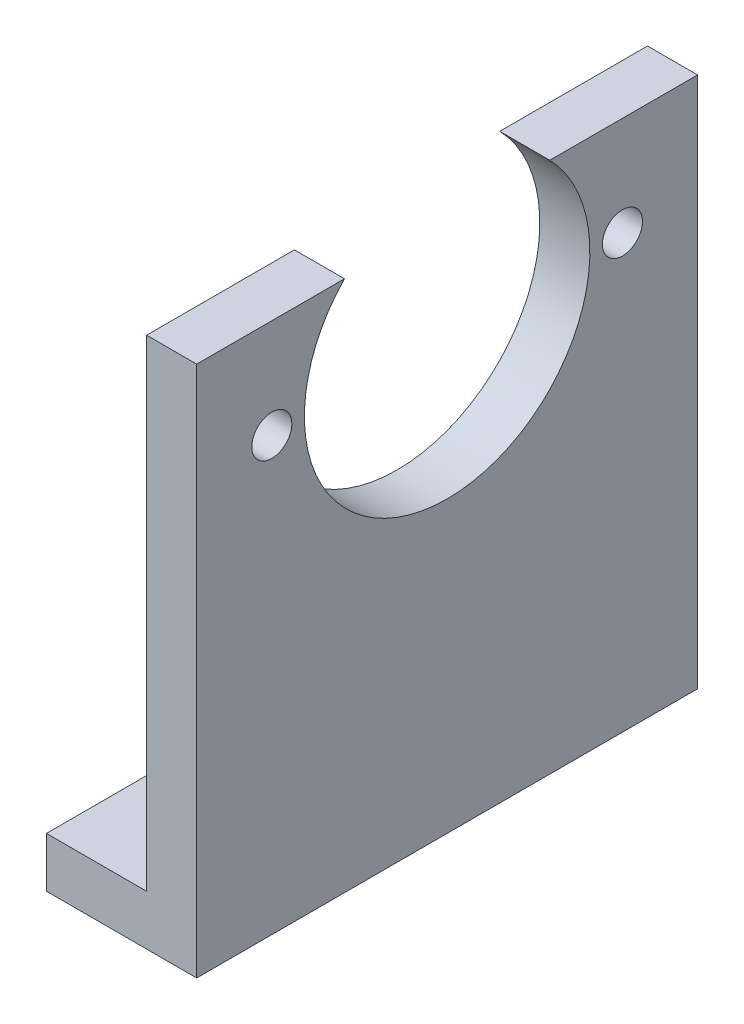
ISO-10303-21;
HEADER;
FILE_DESCRIPTION(('STEP AP214'),'2;1');
FILE_NAME('part.step','',(''),(''),'','','');
FILE_SCHEMA(('AUTOMOTIVE_DESIGN { 1 0 10303 214 1 1 1 1 }'));
ENDSEC;
DATA;
#1=APPLICATION_CONTEXT('core data for automotive mechanical design processes');
#2=APPLICATION_PROTOCOL_DEFINITION('international standard','automotive_design',2000,#1);
#3=PRODUCT_CONTEXT('',#1,'mechanical');
#4=PRODUCT('Part','Part','',(#3));
#5=PRODUCT_RELATED_PRODUCT_CATEGORY('part','',(#4));
#6=PRODUCT_DEFINITION_FORMATION('','',#4);
#7=PRODUCT_DEFINITION_CONTEXT('part definition',#1,'design');
#8=PRODUCT_DEFINITION('design','',#6,#7);
#9=PRODUCT_DEFINITION_SHAPE('','',#8);
#10=(LENGTH_UNIT() NAMED_UNIT(*) SI_UNIT(.MILLI.,.METRE.));
#11=(NAMED_UNIT(*) PLANE_ANGLE_UNIT() SI_UNIT($,.RADIAN.));
#12=(NAMED_UNIT(*) SI_UNIT($,.STERADIAN.) SOLID_ANGLE_UNIT());
#13=UNCERTAINTY_MEASURE_WITH_UNIT(LENGTH_MEASURE(1.E-05),#10,'distance_accuracy_value','');
#14=(GEOMETRIC_REPRESENTATION_CONTEXT(3) GLOBAL_UNCERTAINTY_ASSIGNED_CONTEXT((#13)) GLOBAL_UNIT_ASSIGNED_CONTEXT((#10,
#11,#12)) REPRESENTATION_CONTEXT('',''));
#15=CARTESIAN_POINT('',(0.,0.,0.));
#16=DIRECTION('',(0.,0.,1.));
#17=DIRECTION('',(1.,0.,0.));
#18=AXIS2_PLACEMENT_3D('',#15,#16,#17);
#19=CARTESIAN_POINT('',(0.,0.,0.));
#20=DIRECTION('',(1.,0.,0.));
#21=DIRECTION('',(0.,0.,-1.));
#22=AXIS2_PLACEMENT_3D('',#19,#20,#21);
#23=PLANE('',#22);
#24=CARTESIAN_POINT('',(0.,0.,17.5));
#25=DIRECTION('',(1.,0.,0.));
#26=DIRECTION('',(0.,0.,-1.));
#27=AXIS2_PLACEMENT_3D('',#24,#25,#26);
#28=CIRCLE('',#27,2.);
#29=CARTESIAN_POINT('',(0.,0.,15.5));
#30=VERTEX_POINT('',#29);
#31=EDGE_CURVE('E155',#30,#30,#28,.T.);
#32=ORIENTED_EDGE('',*,*,#31,.T.);
#33=EDGE_LOOP('',(#32));
#34=FACE_BOUND('',#33,.T.);
#35=CARTESIAN_POINT('',(0.,0.,-17.5));
#36=DIRECTION('',(1.,0.,0.));
#37=DIRECTION('',(0.,0.,-1.));
#38=AXIS2_PLACEMENT_3D('',#35,#36,#37);
#39=CIRCLE('',#38,2.);
#40=CARTESIAN_POINT('',(0.,0.,-19.5));
#41=VERTEX_POINT('',#40);
#42=EDGE_CURVE('E165',#41,#41,#39,.T.);
#43=ORIENTED_EDGE('',*,*,#42,.T.);
#44=EDGE_LOOP('',(#43));
#45=FACE_BOUND('',#44,.T.);
#46=DIRECTION('',(0.,0.,-1.));
#47=VECTOR('',#46,1.);
#48=CARTESIAN_POINT('',(0.,-38.1668992247954,-25.));
#49=LINE('',#48,#47);
#50=CARTESIAN_POINT('',(0.,-38.1668992247954,25.));
#51=VERTEX_POINT('',#50);
#52=CARTESIAN_POINT('',(0.,-38.1668992247954,-25.));
#53=VERTEX_POINT('',#52);
#54=EDGE_CURVE('E50',#51,#53,#49,.T.);
#55=ORIENTED_EDGE('',*,*,#54,.F.);
#56=DIRECTION('',(0.,-1.,0.));
#57=VECTOR('',#56,1.);
#58=CARTESIAN_POINT('',(0.,9.90310077520462,25.));
#59=LINE('',#58,#57);
#60=CARTESIAN_POINT('',(0.,9.90310077520462,25.));
#61=VERTEX_POINT('',#60);
#62=EDGE_CURVE('E131',#61,#51,#59,.T.);
#63=ORIENTED_EDGE('',*,*,#62,.F.);
#64=DIRECTION('',(0.,0.,1.));
#65=VECTOR('',#64,1.);
#66=CARTESIAN_POINT('',(0.,9.90310077520462,25.));
#67=LINE('',#66,#65);
#68=CARTESIAN_POINT('',(0.,9.90310077520462,10.2465162390025));
#69=VERTEX_POINT('',#68);
#70=EDGE_CURVE('E81',#69,#61,#67,.T.);
#71=ORIENTED_EDGE('',*,*,#70,.F.);
#72=CARTESIAN_POINT('',(0.,0.,0.));
#73=DIRECTION('',(-1.,0.,0.));
#74=DIRECTION('',(0.,0.,-1.));
#75=AXIS2_PLACEMENT_3D('',#72,#73,#74);
#76=CIRCLE('',#75,14.25);
#77=CARTESIAN_POINT('',(0.,9.90310077520463,-10.2465162390025));
#78=VERTEX_POINT('',#77);
#79=EDGE_CURVE('E114',#78,#69,#76,.T.);
#80=ORIENTED_EDGE('',*,*,#79,.F.);
#81=DIRECTION('',(0.,0.,1.));
#82=VECTOR('',#81,1.);
#83=CARTESIAN_POINT('',(0.,9.90310077520463,-10.2465162390025));
#84=LINE('',#83,#82);
#85=CARTESIAN_POINT('',(0.,9.90310077520463,-25.));
#86=VERTEX_POINT('',#85);
#87=EDGE_CURVE('E126',#86,#78,#84,.T.);
#88=ORIENTED_EDGE('',*,*,#87,.F.);
#89=DIRECTION('',(0.,1.,0.));
#90=VECTOR('',#89,1.);
#91=CARTESIAN_POINT('',(0.,9.90310077520463,-25.));
#92=LINE('',#91,#90);
#93=EDGE_CURVE('E124',#53,#86,#92,.T.);
#94=ORIENTED_EDGE('',*,*,#93,.F.);
#95=EDGE_LOOP('',(#55,#63,#71,#80,#88,#94));
#96=FACE_BOUND('',#95,.T.);
#97=ADVANCED_FACE('F35',(#34,#45,#96),#23,.F.);
#98=CARTESIAN_POINT('',(5.,0.,0.));
#99=DIRECTION('',(1.,0.,0.));
#100=DIRECTION('',(0.,0.,-1.));
#101=AXIS2_PLACEMENT_3D('',#98,#99,#100);
#102=PLANE('',#101);
#103=CARTESIAN_POINT('',(5.,0.,-17.5));
#104=DIRECTION('',(1.,0.,0.));
#105=DIRECTION('',(0.,0.,-1.));
#106=AXIS2_PLACEMENT_3D('',#103,#104,#105);
#107=CIRCLE('',#106,2.);
#108=CARTESIAN_POINT('',(5.,0.,-19.5));
#109=VERTEX_POINT('',#108);
#110=EDGE_CURVE('E127',#109,#109,#107,.T.);
#111=ORIENTED_EDGE('',*,*,#110,.F.);
#112=EDGE_LOOP('',(#111));
#113=FACE_BOUND('',#112,.T.);
#114=DIRECTION('',(0.,0.,-1.));
#115=VECTOR('',#114,1.);
#116=CARTESIAN_POINT('',(5.,-43.1668992247954,25.));
#117=LINE('',#116,#115);
#118=CARTESIAN_POINT('',(5.,-43.1668992247954,25.));
#119=VERTEX_POINT('',#118);
#120=CARTESIAN_POINT('',(5.,-43.1668992247954,-25.));
#121=VERTEX_POINT('',#120);
#122=EDGE_CURVE('E133',#119,#121,#117,.T.);
#123=ORIENTED_EDGE('',*,*,#122,.T.);
#124=DIRECTION('',(0.,1.,0.));
#125=VECTOR('',#124,1.);
#126=CARTESIAN_POINT('',(5.,9.90310077520463,-25.));
#127=LINE('',#126,#125);
#128=CARTESIAN_POINT('',(5.,9.90310077520463,-25.));
#129=VERTEX_POINT('',#128);
#130=EDGE_CURVE('E89',#121,#129,#127,.T.);
#131=ORIENTED_EDGE('',*,*,#130,.T.);
#132=DIRECTION('',(0.,0.,1.));
#133=VECTOR('',#132,1.);
#134=CARTESIAN_POINT('',(5.,9.90310077520463,-10.2465162390025));
#135=LINE('',#134,#133);
#136=CARTESIAN_POINT('',(5.,9.90310077520463,-10.2465162390025));
#137=VERTEX_POINT('',#136);
#138=EDGE_CURVE('E106',#129,#137,#135,.T.);
#139=ORIENTED_EDGE('',*,*,#138,.T.);
#140=CARTESIAN_POINT('',(5.,0.,0.));
#141=DIRECTION('',(-1.,0.,0.));
#142=DIRECTION('',(0.,0.,-1.));
#143=AXIS2_PLACEMENT_3D('',#140,#141,#142);
#144=CIRCLE('',#143,14.25);
#145=CARTESIAN_POINT('',(5.,9.90310077520462,10.2465162390025));
#146=VERTEX_POINT('',#145);
#147=EDGE_CURVE('E99',#137,#146,#144,.T.);
#148=ORIENTED_EDGE('',*,*,#147,.T.);
#149=DIRECTION('',(0.,0.,1.));
#150=VECTOR('',#149,1.);
#151=CARTESIAN_POINT('',(5.,9.90310077520462,25.));
#152=LINE('',#151,#150);
#153=CARTESIAN_POINT('',(5.,9.90310077520462,25.));
#154=VERTEX_POINT('',#153);
#155=EDGE_CURVE('E104',#146,#154,#152,.T.);
#156=ORIENTED_EDGE('',*,*,#155,.T.);
#157=DIRECTION('',(0.,-1.,0.));
#158=VECTOR('',#157,1.);
#159=CARTESIAN_POINT('',(5.,9.90310077520462,25.));
#160=LINE('',#159,#158);
#161=EDGE_CURVE('E59',#154,#119,#160,.T.);
#162=ORIENTED_EDGE('',*,*,#161,.T.);
#163=EDGE_LOOP('',(#123,#131,#139,#148,#156,#162));
#164=FACE_BOUND('',#163,.T.);
#165=CARTESIAN_POINT('',(5.,0.,17.5));
#166=DIRECTION('',(1.,0.,0.));
#167=DIRECTION('',(0.,0.,-1.));
#168=AXIS2_PLACEMENT_3D('',#165,#166,#167);
#169=CIRCLE('',#168,2.);
#170=CARTESIAN_POINT('',(5.,0.,15.5));
#171=VERTEX_POINT('',#170);
#172=EDGE_CURVE('E159',#171,#171,#169,.T.);
#173=ORIENTED_EDGE('',*,*,#172,.F.);
#174=EDGE_LOOP('',(#173));
#175=FACE_BOUND('',#174,.T.);
#176=ADVANCED_FACE('F101',(#113,#164,#175),#102,.T.);
#177=CARTESIAN_POINT('',(5.,-43.1668992247954,25.));
#178=DIRECTION('',(0.,1.,0.));
#179=DIRECTION('',(0.,0.,1.));
#180=AXIS2_PLACEMENT_3D('',#177,#178,#179);
#181=PLANE('',#180);
#182=DIRECTION('',(-1.,0.,0.));
#183=VECTOR('',#182,1.);
#184=CARTESIAN_POINT('',(5.,-43.1668992247954,25.));
#185=LINE('',#184,#183);
#186=CARTESIAN_POINT('',(-10.,-43.1668992247954,25.));
#187=VERTEX_POINT('',#186);
#188=EDGE_CURVE('E120',#119,#187,#185,.T.);
#189=ORIENTED_EDGE('',*,*,#188,.T.);
#190=DIRECTION('',(0.,0.,1.));
#191=VECTOR('',#190,1.);
#192=CARTESIAN_POINT('',(-10.,-43.1668992247954,-25.));
#193=LINE('',#192,#191);
#194=CARTESIAN_POINT('',(-10.,-43.1668992247954,-25.));
#195=VERTEX_POINT('',#194);
#196=EDGE_CURVE('E178',#195,#187,#193,.T.);
#197=ORIENTED_EDGE('',*,*,#196,.F.);
#198=DIRECTION('',(-1.,0.,0.));
#199=VECTOR('',#198,1.);
#200=CARTESIAN_POINT('',(5.,-43.1668992247954,-25.));
#201=LINE('',#200,#199);
#202=EDGE_CURVE('E11',#121,#195,#201,.T.);
#203=ORIENTED_EDGE('',*,*,#202,.F.);
#204=ORIENTED_EDGE('',*,*,#122,.F.);
#205=EDGE_LOOP('',(#189,#197,#203,#204));
#206=FACE_BOUND('',#205,.T.);
#207=ADVANCED_FACE('F37',(#206),#181,.F.);
#208=CARTESIAN_POINT('',(5.,9.90310077520463,-25.));
#209=DIRECTION('',(0.,0.,1.));
#210=DIRECTION('',(0.,-1.,0.));
#211=AXIS2_PLACEMENT_3D('',#208,#209,#210);
#212=PLANE('',#211);
#213=ORIENTED_EDGE('',*,*,#202,.T.);
#214=DIRECTION('',(0.,-1.,0.));
#215=VECTOR('',#214,1.);
#216=CARTESIAN_POINT('',(-10.,-43.1668992247954,-25.));
#217=LINE('',#216,#215);
#218=CARTESIAN_POINT('',(-10.,-38.1668992247954,-25.));
#219=VERTEX_POINT('',#218);
#220=EDGE_CURVE('E182',#219,#195,#217,.T.);
#221=ORIENTED_EDGE('',*,*,#220,.F.);
#222=DIRECTION('',(1.,0.,0.));
#223=VECTOR('',#222,1.);
#224=CARTESIAN_POINT('',(-10.,-38.1668992247954,-25.));
#225=LINE('',#224,#223);
#226=EDGE_CURVE('E156',#219,#53,#225,.T.);
#227=ORIENTED_EDGE('',*,*,#226,.T.);
#228=ORIENTED_EDGE('',*,*,#93,.T.);
#229=DIRECTION('',(-1.,0.,0.));
#230=VECTOR('',#229,1.);
#231=CARTESIAN_POINT('',(5.,9.90310077520463,-25.));
#232=LINE('',#231,#230);
#233=EDGE_CURVE('E43',#129,#86,#232,.T.);
#234=ORIENTED_EDGE('',*,*,#233,.F.);
#235=ORIENTED_EDGE('',*,*,#130,.F.);
#236=EDGE_LOOP('',(#213,#221,#227,#228,#234,#235));
#237=FACE_BOUND('',#236,.T.);
#238=ADVANCED_FACE('F181',(#237),#212,.F.);
#239=CARTESIAN_POINT('',(5.,9.90310077520463,-10.2465162390025));
#240=DIRECTION('',(0.,-1.,0.));
#241=DIRECTION('',(0.,0.,-1.));
#242=AXIS2_PLACEMENT_3D('',#239,#240,#241);
#243=PLANE('',#242);
#244=ORIENTED_EDGE('',*,*,#87,.T.);
#245=DIRECTION('',(-1.,0.,0.));
#246=VECTOR('',#245,1.);
#247=CARTESIAN_POINT('',(5.,9.90310077520463,-10.2465162390025));
#248=LINE('',#247,#246);
#249=EDGE_CURVE('E115',#137,#78,#248,.T.);
#250=ORIENTED_EDGE('',*,*,#249,.F.);
#251=ORIENTED_EDGE('',*,*,#138,.F.);
#252=ORIENTED_EDGE('',*,*,#233,.T.);
#253=EDGE_LOOP('',(#244,#250,#251,#252));
#254=FACE_BOUND('',#253,.T.);
#255=ADVANCED_FACE('F140',(#254),#243,.F.);
#256=CARTESIAN_POINT('',(5.,0.,0.));
#257=DIRECTION('',(-1.,0.,0.));
#258=DIRECTION('',(0.,0.,1.));
#259=AXIS2_PLACEMENT_3D('',#256,#257,#258);
#260=CYLINDRICAL_SURFACE('',#259,14.25);
#261=ORIENTED_EDGE('',*,*,#79,.T.);
#262=DIRECTION('',(-1.,0.,0.));
#263=VECTOR('',#262,1.);
#264=CARTESIAN_POINT('',(5.,9.90310077520462,10.2465162390025));
#265=LINE('',#264,#263);
#266=EDGE_CURVE('E111',#146,#69,#265,.T.);
#267=ORIENTED_EDGE('',*,*,#266,.F.);
#268=ORIENTED_EDGE('',*,*,#147,.F.);
#269=ORIENTED_EDGE('',*,*,#249,.T.);
#270=EDGE_LOOP('',(#261,#267,#268,#269));
#271=FACE_BOUND('',#270,.T.);
#272=ADVANCED_FACE('F112',(#271),#260,.F.);
#273=CARTESIAN_POINT('',(5.,9.90310077520462,25.));
#274=DIRECTION('',(0.,-1.,0.));
#275=DIRECTION('',(0.,0.,-1.));
#276=AXIS2_PLACEMENT_3D('',#273,#274,#275);
#277=PLANE('',#276);
#278=ORIENTED_EDGE('',*,*,#70,.T.);
#279=DIRECTION('',(-1.,0.,0.));
#280=VECTOR('',#279,1.);
#281=CARTESIAN_POINT('',(5.,9.90310077520462,25.));
#282=LINE('',#281,#280);
#283=EDGE_CURVE('E116',#154,#61,#282,.T.);
#284=ORIENTED_EDGE('',*,*,#283,.F.);
#285=ORIENTED_EDGE('',*,*,#155,.F.);
#286=ORIENTED_EDGE('',*,*,#266,.T.);
#287=EDGE_LOOP('',(#278,#284,#285,#286));
#288=FACE_BOUND('',#287,.T.);
#289=ADVANCED_FACE('F118',(#288),#277,.F.);
#290=CARTESIAN_POINT('',(5.,9.90310077520462,25.));
#291=DIRECTION('',(0.,0.,-1.));
#292=DIRECTION('',(0.,1.,0.));
#293=AXIS2_PLACEMENT_3D('',#290,#291,#292);
#294=PLANE('',#293);
#295=ORIENTED_EDGE('',*,*,#62,.T.);
#296=DIRECTION('',(1.,0.,0.));
#297=VECTOR('',#296,1.);
#298=CARTESIAN_POINT('',(-10.,-38.1668992247954,25.));
#299=LINE('',#298,#297);
#300=CARTESIAN_POINT('',(-10.,-38.1668992247954,25.));
#301=VERTEX_POINT('',#300);
#302=EDGE_CURVE('E147',#301,#51,#299,.T.);
#303=ORIENTED_EDGE('',*,*,#302,.F.);
#304=DIRECTION('',(0.,1.,0.));
#305=VECTOR('',#304,1.);
#306=CARTESIAN_POINT('',(-10.,-43.1668992247954,25.));
#307=LINE('',#306,#305);
#308=EDGE_CURVE('E190',#187,#301,#307,.T.);
#309=ORIENTED_EDGE('',*,*,#308,.F.);
#310=ORIENTED_EDGE('',*,*,#188,.F.);
#311=ORIENTED_EDGE('',*,*,#161,.F.);
#312=ORIENTED_EDGE('',*,*,#283,.T.);
#313=EDGE_LOOP('',(#295,#303,#309,#310,#311,#312));
#314=FACE_BOUND('',#313,.T.);
#315=ADVANCED_FACE('F144',(#314),#294,.F.);
#316=CARTESIAN_POINT('',(5.,0.,-17.5));
#317=DIRECTION('',(-1.,0.,0.));
#318=DIRECTION('',(0.,0.,1.));
#319=AXIS2_PLACEMENT_3D('',#316,#317,#318);
#320=CYLINDRICAL_SURFACE('',#319,2.);
#321=ORIENTED_EDGE('',*,*,#110,.T.);
#322=EDGE_LOOP('',(#321));
#323=FACE_BOUND('',#322,.T.);
#324=ORIENTED_EDGE('',*,*,#42,.F.);
#325=EDGE_LOOP('',(#324));
#326=FACE_BOUND('',#325,.T.);
#327=ADVANCED_FACE('F215',(#323,#326),#320,.F.);
#328=CARTESIAN_POINT('',(5.,0.,17.5));
#329=DIRECTION('',(-1.,0.,0.));
#330=DIRECTION('',(0.,0.,1.));
#331=AXIS2_PLACEMENT_3D('',#328,#329,#330);
#332=CYLINDRICAL_SURFACE('',#331,2.);
#333=ORIENTED_EDGE('',*,*,#172,.T.);
#334=EDGE_LOOP('',(#333));
#335=FACE_BOUND('',#334,.T.);
#336=ORIENTED_EDGE('',*,*,#31,.F.);
#337=EDGE_LOOP('',(#336));
#338=FACE_BOUND('',#337,.T.);
#339=ADVANCED_FACE('F200',(#335,#338),#332,.F.);
#340=CARTESIAN_POINT('',(-10.,-38.1668992247954,-25.));
#341=DIRECTION('',(0.,-1.,0.));
#342=DIRECTION('',(0.,0.,-1.));
#343=AXIS2_PLACEMENT_3D('',#340,#341,#342);
#344=PLANE('',#343);
#345=ORIENTED_EDGE('',*,*,#54,.T.);
#346=ORIENTED_EDGE('',*,*,#226,.F.);
#347=DIRECTION('',(0.,0.,-1.));
#348=VECTOR('',#347,1.);
#349=CARTESIAN_POINT('',(-10.,-38.1668992247954,-25.));
#350=LINE('',#349,#348);
#351=EDGE_CURVE('E154',#301,#219,#350,.T.);
#352=ORIENTED_EDGE('',*,*,#351,.F.);
#353=ORIENTED_EDGE('',*,*,#302,.T.);
#354=EDGE_LOOP('',(#345,#346,#352,#353));
#355=FACE_BOUND('',#354,.T.);
#356=ADVANCED_FACE('F150',(#355),#344,.F.);
#357=CARTESIAN_POINT('',(-10.,0.,0.));
#358=DIRECTION('',(1.,0.,0.));
#359=DIRECTION('',(0.,0.,-1.));
#360=AXIS2_PLACEMENT_3D('',#357,#358,#359);
#361=PLANE('',#360);
#362=ORIENTED_EDGE('',*,*,#220,.T.);
#363=ORIENTED_EDGE('',*,*,#196,.T.);
#364=ORIENTED_EDGE('',*,*,#308,.T.);
#365=ORIENTED_EDGE('',*,*,#351,.T.);
#366=EDGE_LOOP('',(#362,#363,#364,#365));
#367=FACE_BOUND('',#366,.T.);
#368=ADVANCED_FACE('F189',(#367),#361,.F.);
#369=CLOSED_SHELL('',(#97,#176,#207,#238,#255,#272,#289,#315,#327,#339,#356,#368));
#370=MANIFOLD_SOLID_BREP('B2',#369);
#371=ADVANCED_BREP_SHAPE_REPRESENTATION('',(#18,#370),#14);
#372=SHAPE_DEFINITION_REPRESENTATION(#9,#371);
ENDSEC;
END-ISO-10303-21;
